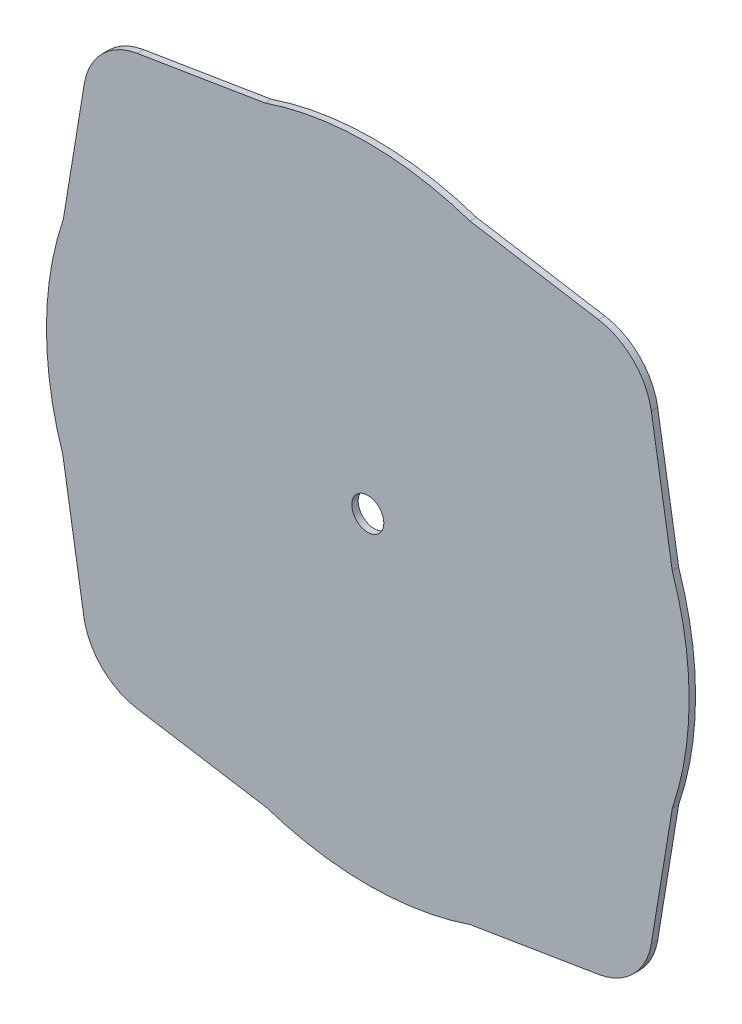
ISO-10303-21;
HEADER;
FILE_DESCRIPTION(('STEP AP214'),'2;1');
FILE_NAME('part.step','',(''),(''),'','','');
FILE_SCHEMA(('AUTOMOTIVE_DESIGN { 1 0 10303 214 1 1 1 1 }'));
ENDSEC;
DATA;
#1=APPLICATION_CONTEXT('core data for automotive mechanical design processes');
#2=APPLICATION_PROTOCOL_DEFINITION('international standard','automotive_design',2000,#1);
#3=PRODUCT_CONTEXT('',#1,'mechanical');
#4=PRODUCT('Part','Part','',(#3));
#5=PRODUCT_RELATED_PRODUCT_CATEGORY('part','',(#4));
#6=PRODUCT_DEFINITION_FORMATION('','',#4);
#7=PRODUCT_DEFINITION_CONTEXT('part definition',#1,'design');
#8=PRODUCT_DEFINITION('design','',#6,#7);
#9=PRODUCT_DEFINITION_SHAPE('','',#8);
#10=(LENGTH_UNIT() NAMED_UNIT(*) SI_UNIT(.MILLI.,.METRE.));
#11=(NAMED_UNIT(*) PLANE_ANGLE_UNIT() SI_UNIT($,.RADIAN.));
#12=(NAMED_UNIT(*) SI_UNIT($,.STERADIAN.) SOLID_ANGLE_UNIT());
#13=UNCERTAINTY_MEASURE_WITH_UNIT(LENGTH_MEASURE(1.E-05),#10,'distance_accuracy_value','');
#14=(GEOMETRIC_REPRESENTATION_CONTEXT(3) GLOBAL_UNCERTAINTY_ASSIGNED_CONTEXT((#13)) GLOBAL_UNIT_ASSIGNED_CONTEXT((#10,
#11,#12)) REPRESENTATION_CONTEXT('',''));
#15=CARTESIAN_POINT('',(0.,0.,0.));
#16=DIRECTION('',(0.,0.,1.));
#17=DIRECTION('',(1.,0.,0.));
#18=AXIS2_PLACEMENT_3D('',#15,#16,#17);
#19=CARTESIAN_POINT('',(-2.15173033894841,-50.4765277075778,3.81));
#20=DIRECTION('',(0.,0.,-1.));
#21=DIRECTION('',(-1.,0.,0.));
#22=AXIS2_PLACEMENT_3D('',#19,#20,#21);
#23=PLANE('',#22);
#24=CARTESIAN_POINT('',(-2.15173033894841,-50.4765277075778,3.81));
#25=DIRECTION('',(0.,0.,1.));
#26=DIRECTION('',(-1.,0.,0.));
#27=AXIS2_PLACEMENT_3D('',#24,#25,#26);
#28=CIRCLE('',#27,25.4);
#29=CARTESIAN_POINT('',(1.96053811004022,-75.5414284295725,3.81));
#30=VERTEX_POINT('',#29);
#31=CARTESIAN_POINT('',(22.9131703830464,-54.5887961565664,3.81));
#32=VERTEX_POINT('',#31);
#33=EDGE_CURVE('E210',#30,#32,#28,.T.);
#34=ORIENTED_EDGE('',*,*,#33,.T.);
#35=DIRECTION('',(0.161900332637346,0.986807115039163,0.));
#36=VECTOR('',#35,1.);
#37=CARTESIAN_POINT('',(22.9131703830464,-54.5887961565664,3.81));
#38=LINE('',#37,#36);
#39=CARTESIAN_POINT('',(31.2401384979266,-3.83466088944323,3.81));
#40=VERTEX_POINT('',#39);
#41=EDGE_CURVE('E118',#32,#40,#38,.T.);
#42=ORIENTED_EDGE('',*,*,#41,.T.);
#43=CARTESIAN_POINT('',(-89.5119708181495,36.8837127716233,3.81));
#44=DIRECTION('',(0.,0.,1.));
#45=DIRECTION('',(1.,0.,0.));
#46=AXIS2_PLACEMENT_3D('',#43,#44,#45);
#47=CIRCLE('',#46,127.432562);
#48=CARTESIAN_POINT('',(31.2401384979268,77.6020864326893,3.81));
#49=VERTEX_POINT('',#48);
#50=EDGE_CURVE('E249',#40,#49,#47,.T.);
#51=ORIENTED_EDGE('',*,*,#50,.T.);
#52=DIRECTION('',(-0.161900332637348,0.986807115039163,0.));
#53=VECTOR('',#52,1.);
#54=CARTESIAN_POINT('',(22.911997890501,128.363368219942,3.81));
#55=LINE('',#54,#53);
#56=CARTESIAN_POINT('',(22.911997890501,128.363368219942,3.81));
#57=VERTEX_POINT('',#56);
#58=EDGE_CURVE('E268',#49,#57,#55,.T.);
#59=ORIENTED_EDGE('',*,*,#58,.T.);
#60=CARTESIAN_POINT('',(-2.15290283149376,124.251099770954,3.81));
#61=DIRECTION('',(0.,0.,1.));
#62=DIRECTION('',(1.,0.,0.));
#63=AXIS2_PLACEMENT_3D('',#60,#61,#62);
#64=CIRCLE('',#63,25.4);
#65=CARTESIAN_POINT('',(1.96879663922517,149.314451371908,3.81));
#66=VERTEX_POINT('',#65);
#67=EDGE_CURVE('E265',#57,#66,#64,.T.);
#68=ORIENTED_EDGE('',*,*,#67,.T.);
#69=DIRECTION('',(-0.986746126021836,0.16227163270547,0.));
#70=VECTOR('',#69,1.);
#71=CARTESIAN_POINT('',(1.96879663922517,149.314451371908,3.81));
#72=LINE('',#71,#70);
#73=CARTESIAN_POINT('',(-48.948025434056,157.68778634847,3.81));
#74=VERTEX_POINT('',#73);
#75=EDGE_CURVE('E267',#66,#74,#72,.T.);
#76=ORIENTED_EDGE('',*,*,#75,.T.);
#77=CARTESIAN_POINT('',(-89.5119708181495,36.8837127716233,3.81));
#78=DIRECTION('',(0.,0.,1.));
#79=DIRECTION('',(1.,0.,0.));
#80=AXIS2_PLACEMENT_3D('',#77,#78,#79);
#81=CIRCLE('',#80,127.432562);
#82=CARTESIAN_POINT('',(-130.390296860395,157.581767096736,3.81));
#83=VERTEX_POINT('',#82);
#84=EDGE_CURVE('E270',#74,#83,#81,.T.);
#85=ORIENTED_EDGE('',*,*,#84,.T.);
#86=DIRECTION('',(-0.986870966676808,-0.161510665686145,0.));
#87=VECTOR('',#86,1.);
#88=CARTESIAN_POINT('',(-180.975812960225,149.302974169153,3.81));
#89=LINE('',#88,#87);
#90=CARTESIAN_POINT('',(-180.975812960225,149.302974169153,3.81));
#91=VERTEX_POINT('',#90);
#92=EDGE_CURVE('E276',#83,#91,#89,.T.);
#93=ORIENTED_EDGE('',*,*,#92,.T.);
#94=CARTESIAN_POINT('',(-176.873442051797,124.236451615562,3.81));
#95=DIRECTION('',(0.,0.,1.));
#96=DIRECTION('',(-1.,0.,0.));
#97=AXIS2_PLACEMENT_3D('',#94,#95,#96);
#98=CIRCLE('',#97,25.4);
#99=CARTESIAN_POINT('',(-201.938342773792,128.34872006455,3.81));
#100=VERTEX_POINT('',#99);
#101=EDGE_CURVE('E278',#91,#100,#98,.T.);
#102=ORIENTED_EDGE('',*,*,#101,.T.);
#103=DIRECTION('',(-0.161900332637347,-0.986807115039163,0.));
#104=VECTOR('',#103,1.);
#105=CARTESIAN_POINT('',(-201.938342773792,128.34872006455,3.81));
#106=LINE('',#105,#104);
#107=CARTESIAN_POINT('',(-210.264080134226,77.6020864326893,3.81));
#108=VERTEX_POINT('',#107);
#109=EDGE_CURVE('E280',#100,#108,#106,.T.);
#110=ORIENTED_EDGE('',*,*,#109,.T.);
#111=CARTESIAN_POINT('',(-89.5119708181495,36.8837127716233,3.81));
#112=DIRECTION('',(0.,0.,1.));
#113=DIRECTION('',(1.,0.,0.));
#114=AXIS2_PLACEMENT_3D('',#111,#112,#113);
#115=CIRCLE('',#114,127.432562);
#116=CARTESIAN_POINT('',(-210.433208356934,-3.32962046466251,3.81));
#117=VERTEX_POINT('',#116);
#118=EDGE_CURVE('E282',#108,#117,#115,.T.);
#119=ORIENTED_EDGE('',*,*,#118,.T.);
#120=DIRECTION('',(0.159837788965892,-0.987143293153783,0.));
#121=VECTOR('',#120,1.);
#122=CARTESIAN_POINT('',(-202.114490475035,-54.7052470788899,3.81));
#123=LINE('',#122,#121);
#124=CARTESIAN_POINT('',(-202.114490475035,-54.7052470788899,3.81));
#125=VERTEX_POINT('',#124);
#126=EDGE_CURVE('E284',#117,#125,#123,.T.);
#127=ORIENTED_EDGE('',*,*,#126,.T.);
#128=CARTESIAN_POINT('',(-177.041050828929,-50.6453672391563,3.81));
#129=DIRECTION('',(0.,0.,1.));
#130=DIRECTION('',(1.,0.,0.));
#131=AXIS2_PLACEMENT_3D('',#128,#129,#130);
#132=CIRCLE('',#131,25.4);
#133=CARTESIAN_POINT('',(-181.100930668663,-75.7188068852624,3.81));
#134=VERTEX_POINT('',#133);
#135=EDGE_CURVE('E161',#125,#134,#132,.T.);
#136=ORIENTED_EDGE('',*,*,#135,.T.);
#137=DIRECTION('',(0.987143293153783,-0.159837788965891,0.));
#138=VECTOR('',#137,1.);
#139=CARTESIAN_POINT('',(-129.725304054436,-84.0375247671616,3.81));
#140=LINE('',#139,#138);
#141=CARTESIAN_POINT('',(-129.725304054436,-84.0375247671616,3.81));
#142=VERTEX_POINT('',#141);
#143=EDGE_CURVE('E155',#134,#142,#140,.T.);
#144=ORIENTED_EDGE('',*,*,#143,.T.);
#145=CARTESIAN_POINT('',(-89.5119708181495,36.8837127716233,3.81));
#146=DIRECTION('',(0.,0.,1.));
#147=DIRECTION('',(1.,0.,0.));
#148=AXIS2_PLACEMENT_3D('',#145,#146,#147);
#149=CIRCLE('',#148,127.432562);
#150=CARTESIAN_POINT('',(-48.7935971570835,-83.868396544453,3.81));
#151=VERTEX_POINT('',#150);
#152=EDGE_CURVE('E159',#142,#151,#149,.T.);
#153=ORIENTED_EDGE('',*,*,#152,.T.);
#154=DIRECTION('',(0.986807115039163,0.161900332637348,0.));
#155=VECTOR('',#154,1.);
#156=CARTESIAN_POINT('',(1.96053811004022,-75.5414284295725,3.81));
#157=LINE('',#156,#155);
#158=EDGE_CURVE('E51',#151,#30,#157,.T.);
#159=ORIENTED_EDGE('',*,*,#158,.T.);
#160=EDGE_LOOP('',(#34,#42,#51,#59,#68,#76,#85,#93,#102,#110,#119,#127,#136,#144,#153,#159));
#161=FACE_BOUND('',#160,.T.);
#162=CARTESIAN_POINT('',(-89.5119708181495,36.8837127716233,3.81));
#163=DIRECTION('',(0.,0.,1.));
#164=DIRECTION('',(1.,0.,0.));
#165=AXIS2_PLACEMENT_3D('',#162,#163,#164);
#166=CIRCLE('',#165,6.34999999993624);
#167=CARTESIAN_POINT('',(-83.1619708182132,36.8837127716233,3.81));
#168=VERTEX_POINT('',#167);
#169=EDGE_CURVE('E183',#168,#168,#166,.T.);
#170=ORIENTED_EDGE('',*,*,#169,.F.);
#171=EDGE_LOOP('',(#170));
#172=FACE_BOUND('',#171,.T.);
#173=ADVANCED_FACE('F34',(#161,#172),#23,.F.);
#174=CARTESIAN_POINT('',(-2.15173033894841,-50.4765277075778,1.27));
#175=DIRECTION('',(0.,0.,-1.));
#176=DIRECTION('',(-1.,0.,0.));
#177=AXIS2_PLACEMENT_3D('',#174,#175,#176);
#178=PLANE('',#177);
#179=CARTESIAN_POINT('',(-2.15173033894841,-50.4765277075778,1.27));
#180=DIRECTION('',(0.,0.,1.));
#181=DIRECTION('',(-1.,0.,0.));
#182=AXIS2_PLACEMENT_3D('',#179,#180,#181);
#183=CIRCLE('',#182,25.4);
#184=CARTESIAN_POINT('',(1.96053811004022,-75.5414284295725,1.27));
#185=VERTEX_POINT('',#184);
#186=CARTESIAN_POINT('',(22.9131703830464,-54.5887961565664,1.27));
#187=VERTEX_POINT('',#186);
#188=EDGE_CURVE('E179',#185,#187,#183,.T.);
#189=ORIENTED_EDGE('',*,*,#188,.F.);
#190=DIRECTION('',(0.986807115039163,0.161900332637348,0.));
#191=VECTOR('',#190,1.);
#192=CARTESIAN_POINT('',(1.96053811004022,-75.5414284295725,1.27));
#193=LINE('',#192,#191);
#194=CARTESIAN_POINT('',(-48.7935971570835,-83.868396544453,1.27));
#195=VERTEX_POINT('',#194);
#196=EDGE_CURVE('E110',#195,#185,#193,.T.);
#197=ORIENTED_EDGE('',*,*,#196,.F.);
#198=CARTESIAN_POINT('',(-89.5119708181495,36.8837127716233,1.27));
#199=DIRECTION('',(0.,0.,1.));
#200=DIRECTION('',(1.,0.,0.));
#201=AXIS2_PLACEMENT_3D('',#198,#199,#200);
#202=CIRCLE('',#201,127.432562);
#203=CARTESIAN_POINT('',(-129.725304054436,-84.0375247671616,1.27));
#204=VERTEX_POINT('',#203);
#205=EDGE_CURVE('E104',#204,#195,#202,.T.);
#206=ORIENTED_EDGE('',*,*,#205,.F.);
#207=DIRECTION('',(0.987143293153783,-0.159837788965891,0.));
#208=VECTOR('',#207,1.);
#209=CARTESIAN_POINT('',(-129.725304054436,-84.0375247671616,1.27));
#210=LINE('',#209,#208);
#211=CARTESIAN_POINT('',(-181.100930668663,-75.7188068852624,1.27));
#212=VERTEX_POINT('',#211);
#213=EDGE_CURVE('E169',#212,#204,#210,.T.);
#214=ORIENTED_EDGE('',*,*,#213,.F.);
#215=CARTESIAN_POINT('',(-177.041050828929,-50.6453672391563,1.27));
#216=DIRECTION('',(0.,0.,1.));
#217=DIRECTION('',(1.,0.,0.));
#218=AXIS2_PLACEMENT_3D('',#215,#216,#217);
#219=CIRCLE('',#218,25.4);
#220=CARTESIAN_POINT('',(-202.114490475035,-54.7052470788899,1.27));
#221=VERTEX_POINT('',#220);
#222=EDGE_CURVE('E205',#221,#212,#219,.T.);
#223=ORIENTED_EDGE('',*,*,#222,.F.);
#224=DIRECTION('',(0.159837788965892,-0.987143293153783,0.));
#225=VECTOR('',#224,1.);
#226=CARTESIAN_POINT('',(-202.114490475035,-54.7052470788899,1.27));
#227=LINE('',#226,#225);
#228=CARTESIAN_POINT('',(-210.433208356934,-3.32962046466251,1.27));
#229=VERTEX_POINT('',#228);
#230=EDGE_CURVE('E203',#229,#221,#227,.T.);
#231=ORIENTED_EDGE('',*,*,#230,.F.);
#232=CARTESIAN_POINT('',(-89.5119708181495,36.8837127716233,1.27));
#233=DIRECTION('',(0.,0.,1.));
#234=DIRECTION('',(1.,0.,0.));
#235=AXIS2_PLACEMENT_3D('',#232,#233,#234);
#236=CIRCLE('',#235,127.432562);
#237=CARTESIAN_POINT('',(-210.264080134226,77.6020864326893,1.27));
#238=VERTEX_POINT('',#237);
#239=EDGE_CURVE('E201',#238,#229,#236,.T.);
#240=ORIENTED_EDGE('',*,*,#239,.F.);
#241=DIRECTION('',(-0.161900332637347,-0.986807115039163,0.));
#242=VECTOR('',#241,1.);
#243=CARTESIAN_POINT('',(-201.938342773792,128.34872006455,1.27));
#244=LINE('',#243,#242);
#245=CARTESIAN_POINT('',(-201.938342773792,128.34872006455,1.27));
#246=VERTEX_POINT('',#245);
#247=EDGE_CURVE('E199',#246,#238,#244,.T.);
#248=ORIENTED_EDGE('',*,*,#247,.F.);
#249=CARTESIAN_POINT('',(-176.873442051797,124.236451615562,1.27));
#250=DIRECTION('',(0.,0.,1.));
#251=DIRECTION('',(-1.,0.,0.));
#252=AXIS2_PLACEMENT_3D('',#249,#250,#251);
#253=CIRCLE('',#252,25.4);
#254=CARTESIAN_POINT('',(-180.975812960225,149.302974169153,1.27));
#255=VERTEX_POINT('',#254);
#256=EDGE_CURVE('E197',#255,#246,#253,.T.);
#257=ORIENTED_EDGE('',*,*,#256,.F.);
#258=DIRECTION('',(-0.986870966676808,-0.161510665686145,0.));
#259=VECTOR('',#258,1.);
#260=CARTESIAN_POINT('',(-180.975812960225,149.302974169153,1.27));
#261=LINE('',#260,#259);
#262=CARTESIAN_POINT('',(-130.390296860395,157.581767096736,1.27));
#263=VERTEX_POINT('',#262);
#264=EDGE_CURVE('E195',#263,#255,#261,.T.);
#265=ORIENTED_EDGE('',*,*,#264,.F.);
#266=CARTESIAN_POINT('',(-89.5119708181495,36.8837127716233,1.27));
#267=DIRECTION('',(0.,0.,1.));
#268=DIRECTION('',(1.,0.,0.));
#269=AXIS2_PLACEMENT_3D('',#266,#267,#268);
#270=CIRCLE('',#269,127.432562);
#271=CARTESIAN_POINT('',(-48.948025434056,157.68778634847,1.27));
#272=VERTEX_POINT('',#271);
#273=EDGE_CURVE('E193',#272,#263,#270,.T.);
#274=ORIENTED_EDGE('',*,*,#273,.F.);
#275=DIRECTION('',(-0.986746126021836,0.16227163270547,0.));
#276=VECTOR('',#275,1.);
#277=CARTESIAN_POINT('',(1.96879663922517,149.314451371908,1.27));
#278=LINE('',#277,#276);
#279=CARTESIAN_POINT('',(1.96879663922517,149.314451371908,1.27));
#280=VERTEX_POINT('',#279);
#281=EDGE_CURVE('E191',#280,#272,#278,.T.);
#282=ORIENTED_EDGE('',*,*,#281,.F.);
#283=CARTESIAN_POINT('',(-2.15290283149376,124.251099770954,1.27));
#284=DIRECTION('',(0.,0.,1.));
#285=DIRECTION('',(1.,0.,0.));
#286=AXIS2_PLACEMENT_3D('',#283,#284,#285);
#287=CIRCLE('',#286,25.4);
#288=CARTESIAN_POINT('',(22.911997890501,128.363368219942,1.27));
#289=VERTEX_POINT('',#288);
#290=EDGE_CURVE('E189',#289,#280,#287,.T.);
#291=ORIENTED_EDGE('',*,*,#290,.F.);
#292=DIRECTION('',(-0.161900332637348,0.986807115039163,0.));
#293=VECTOR('',#292,1.);
#294=CARTESIAN_POINT('',(22.911997890501,128.363368219942,1.27));
#295=LINE('',#294,#293);
#296=CARTESIAN_POINT('',(31.2401384979268,77.6020864326893,1.27));
#297=VERTEX_POINT('',#296);
#298=EDGE_CURVE('E187',#297,#289,#295,.T.);
#299=ORIENTED_EDGE('',*,*,#298,.F.);
#300=CARTESIAN_POINT('',(-89.5119708181495,36.8837127716233,1.27));
#301=DIRECTION('',(0.,0.,1.));
#302=DIRECTION('',(1.,0.,0.));
#303=AXIS2_PLACEMENT_3D('',#300,#301,#302);
#304=CIRCLE('',#303,127.432562);
#305=CARTESIAN_POINT('',(31.2401384979266,-3.83466088944323,1.27));
#306=VERTEX_POINT('',#305);
#307=EDGE_CURVE('E185',#306,#297,#304,.T.);
#308=ORIENTED_EDGE('',*,*,#307,.F.);
#309=DIRECTION('',(0.161900332637346,0.986807115039163,0.));
#310=VECTOR('',#309,1.);
#311=CARTESIAN_POINT('',(22.9131703830464,-54.5887961565664,1.27));
#312=LINE('',#311,#310);
#313=EDGE_CURVE('E182',#187,#306,#312,.T.);
#314=ORIENTED_EDGE('',*,*,#313,.F.);
#315=EDGE_LOOP('',(#189,#197,#206,#214,#223,#231,#240,#248,#257,#265,#274,#282,#291,#299,#308,#314));
#316=FACE_BOUND('',#315,.T.);
#317=CARTESIAN_POINT('',(-89.5119708181495,36.8837127716233,1.27));
#318=DIRECTION('',(0.,0.,1.));
#319=DIRECTION('',(1.,0.,0.));
#320=AXIS2_PLACEMENT_3D('',#317,#318,#319);
#321=CIRCLE('',#320,6.34999999993624);
#322=CARTESIAN_POINT('',(-83.1619708182132,36.8837127716233,1.27));
#323=VERTEX_POINT('',#322);
#324=EDGE_CURVE('E483',#323,#323,#321,.T.);
#325=ORIENTED_EDGE('',*,*,#324,.T.);
#326=EDGE_LOOP('',(#325));
#327=FACE_BOUND('',#326,.T.);
#328=ADVANCED_FACE('F253',(#316,#327),#178,.T.);
#329=CARTESIAN_POINT('',(-2.15173033894841,-50.4765277075778,3.81));
#330=DIRECTION('',(0.,0.,-1.));
#331=DIRECTION('',(-1.,0.,0.));
#332=AXIS2_PLACEMENT_3D('',#329,#330,#331);
#333=CYLINDRICAL_SURFACE('',#332,25.4);
#334=ORIENTED_EDGE('',*,*,#188,.T.);
#335=DIRECTION('',(0.,0.,-1.));
#336=VECTOR('',#335,1.);
#337=CARTESIAN_POINT('',(22.9131703830464,-54.5887961565664,3.81));
#338=LINE('',#337,#336);
#339=EDGE_CURVE('E11',#32,#187,#338,.T.);
#340=ORIENTED_EDGE('',*,*,#339,.F.);
#341=ORIENTED_EDGE('',*,*,#33,.F.);
#342=DIRECTION('',(0.,0.,-1.));
#343=VECTOR('',#342,1.);
#344=CARTESIAN_POINT('',(1.96053811004022,-75.5414284295725,3.81));
#345=LINE('',#344,#343);
#346=EDGE_CURVE('E175',#30,#185,#345,.T.);
#347=ORIENTED_EDGE('',*,*,#346,.T.);
#348=EDGE_LOOP('',(#334,#340,#341,#347));
#349=FACE_BOUND('',#348,.T.);
#350=ADVANCED_FACE('F36',(#349),#333,.T.);
#351=CARTESIAN_POINT('',(22.9131703830464,-54.5887961565664,3.81));
#352=DIRECTION('',(-0.986807115039164,0.161900332637346,0.));
#353=DIRECTION('',(-0.161900332637346,-0.986807115039164,0.));
#354=AXIS2_PLACEMENT_3D('',#351,#352,#353);
#355=PLANE('',#354);
#356=ORIENTED_EDGE('',*,*,#313,.T.);
#357=DIRECTION('',(0.,0.,-1.));
#358=VECTOR('',#357,1.);
#359=CARTESIAN_POINT('',(31.2401384979266,-3.83466088944323,3.81));
#360=LINE('',#359,#358);
#361=EDGE_CURVE('E43',#40,#306,#360,.T.);
#362=ORIENTED_EDGE('',*,*,#361,.F.);
#363=ORIENTED_EDGE('',*,*,#41,.F.);
#364=ORIENTED_EDGE('',*,*,#339,.T.);
#365=EDGE_LOOP('',(#356,#362,#363,#364));
#366=FACE_BOUND('',#365,.T.);
#367=ADVANCED_FACE('F318',(#366),#355,.F.);
#368=CARTESIAN_POINT('',(-89.5119708181495,36.8837127716233,3.81));
#369=DIRECTION('',(0.,0.,-1.));
#370=DIRECTION('',(-1.,0.,0.));
#371=AXIS2_PLACEMENT_3D('',#368,#369,#370);
#372=CYLINDRICAL_SURFACE('',#371,127.432562);
#373=ORIENTED_EDGE('',*,*,#307,.T.);
#374=DIRECTION('',(0.,0.,-1.));
#375=VECTOR('',#374,1.);
#376=CARTESIAN_POINT('',(31.2401384979268,77.6020864326893,3.81));
#377=LINE('',#376,#375);
#378=EDGE_CURVE('E241',#49,#297,#377,.T.);
#379=ORIENTED_EDGE('',*,*,#378,.F.);
#380=ORIENTED_EDGE('',*,*,#50,.F.);
#381=ORIENTED_EDGE('',*,*,#361,.T.);
#382=EDGE_LOOP('',(#373,#379,#380,#381));
#383=FACE_BOUND('',#382,.T.);
#384=ADVANCED_FACE('F247',(#383),#372,.T.);
#385=CARTESIAN_POINT('',(22.911997890501,128.363368219942,3.81));
#386=DIRECTION('',(-0.986807115039163,-0.161900332637348,0.));
#387=DIRECTION('',(0.161900332637348,-0.986807115039163,0.));
#388=AXIS2_PLACEMENT_3D('',#385,#386,#387);
#389=PLANE('',#388);
#390=ORIENTED_EDGE('',*,*,#298,.T.);
#391=DIRECTION('',(0.,0.,-1.));
#392=VECTOR('',#391,1.);
#393=CARTESIAN_POINT('',(22.911997890501,128.363368219942,3.81));
#394=LINE('',#393,#392);
#395=EDGE_CURVE('E238',#57,#289,#394,.T.);
#396=ORIENTED_EDGE('',*,*,#395,.F.);
#397=ORIENTED_EDGE('',*,*,#58,.F.);
#398=ORIENTED_EDGE('',*,*,#378,.T.);
#399=EDGE_LOOP('',(#390,#396,#397,#398));
#400=FACE_BOUND('',#399,.T.);
#401=ADVANCED_FACE('F259',(#400),#389,.F.);
#402=CARTESIAN_POINT('',(-2.15290283149376,124.251099770954,3.81));
#403=DIRECTION('',(0.,0.,-1.));
#404=DIRECTION('',(-1.,0.,0.));
#405=AXIS2_PLACEMENT_3D('',#402,#403,#404);
#406=CYLINDRICAL_SURFACE('',#405,25.4);
#407=ORIENTED_EDGE('',*,*,#290,.T.);
#408=DIRECTION('',(0.,0.,-1.));
#409=VECTOR('',#408,1.);
#410=CARTESIAN_POINT('',(1.96879663922517,149.314451371908,3.81));
#411=LINE('',#410,#409);
#412=EDGE_CURVE('E235',#66,#280,#411,.T.);
#413=ORIENTED_EDGE('',*,*,#412,.F.);
#414=ORIENTED_EDGE('',*,*,#67,.F.);
#415=ORIENTED_EDGE('',*,*,#395,.T.);
#416=EDGE_LOOP('',(#407,#413,#414,#415));
#417=FACE_BOUND('',#416,.T.);
#418=ADVANCED_FACE('F263',(#417),#406,.T.);
#419=CARTESIAN_POINT('',(1.96879663922517,149.314451371908,3.81));
#420=DIRECTION('',(-0.16227163270547,-0.986746126021836,0.));
#421=DIRECTION('',(0.986746126021836,-0.16227163270547,0.));
#422=AXIS2_PLACEMENT_3D('',#419,#420,#421);
#423=PLANE('',#422);
#424=ORIENTED_EDGE('',*,*,#281,.T.);
#425=DIRECTION('',(0.,0.,-1.));
#426=VECTOR('',#425,1.);
#427=CARTESIAN_POINT('',(-48.948025434056,157.68778634847,3.81));
#428=LINE('',#427,#426);
#429=EDGE_CURVE('E232',#74,#272,#428,.T.);
#430=ORIENTED_EDGE('',*,*,#429,.F.);
#431=ORIENTED_EDGE('',*,*,#75,.F.);
#432=ORIENTED_EDGE('',*,*,#412,.T.);
#433=EDGE_LOOP('',(#424,#430,#431,#432));
#434=FACE_BOUND('',#433,.T.);
#435=ADVANCED_FACE('F331',(#434),#423,.F.);
#436=CARTESIAN_POINT('',(-89.5119708181495,36.8837127716233,3.81));
#437=DIRECTION('',(0.,0.,-1.));
#438=DIRECTION('',(-1.,0.,0.));
#439=AXIS2_PLACEMENT_3D('',#436,#437,#438);
#440=CYLINDRICAL_SURFACE('',#439,127.432562);
#441=ORIENTED_EDGE('',*,*,#273,.T.);
#442=DIRECTION('',(0.,0.,-1.));
#443=VECTOR('',#442,1.);
#444=CARTESIAN_POINT('',(-130.390296860395,157.581767096736,3.81));
#445=LINE('',#444,#443);
#446=EDGE_CURVE('E229',#83,#263,#445,.T.);
#447=ORIENTED_EDGE('',*,*,#446,.F.);
#448=ORIENTED_EDGE('',*,*,#84,.F.);
#449=ORIENTED_EDGE('',*,*,#429,.T.);
#450=EDGE_LOOP('',(#441,#447,#448,#449));
#451=FACE_BOUND('',#450,.T.);
#452=ADVANCED_FACE('F334',(#451),#440,.T.);
#453=CARTESIAN_POINT('',(-180.975812960225,149.302974169153,3.81));
#454=DIRECTION('',(0.161510665686145,-0.986870966676808,0.));
#455=DIRECTION('',(0.986870966676808,0.161510665686145,0.));
#456=AXIS2_PLACEMENT_3D('',#453,#454,#455);
#457=PLANE('',#456);
#458=ORIENTED_EDGE('',*,*,#264,.T.);
#459=DIRECTION('',(0.,0.,-1.));
#460=VECTOR('',#459,1.);
#461=CARTESIAN_POINT('',(-180.975812960225,149.302974169153,3.81));
#462=LINE('',#461,#460);
#463=EDGE_CURVE('E226',#91,#255,#462,.T.);
#464=ORIENTED_EDGE('',*,*,#463,.F.);
#465=ORIENTED_EDGE('',*,*,#92,.F.);
#466=ORIENTED_EDGE('',*,*,#446,.T.);
#467=EDGE_LOOP('',(#458,#464,#465,#466));
#468=FACE_BOUND('',#467,.T.);
#469=ADVANCED_FACE('F338',(#468),#457,.F.);
#470=CARTESIAN_POINT('',(-176.873442051797,124.236451615562,3.81));
#471=DIRECTION('',(0.,0.,-1.));
#472=DIRECTION('',(-1.,0.,0.));
#473=AXIS2_PLACEMENT_3D('',#470,#471,#472);
#474=CYLINDRICAL_SURFACE('',#473,25.4);
#475=ORIENTED_EDGE('',*,*,#256,.T.);
#476=DIRECTION('',(0.,0.,-1.));
#477=VECTOR('',#476,1.);
#478=CARTESIAN_POINT('',(-201.938342773792,128.34872006455,3.81));
#479=LINE('',#478,#477);
#480=EDGE_CURVE('E223',#100,#246,#479,.T.);
#481=ORIENTED_EDGE('',*,*,#480,.F.);
#482=ORIENTED_EDGE('',*,*,#101,.F.);
#483=ORIENTED_EDGE('',*,*,#463,.T.);
#484=EDGE_LOOP('',(#475,#481,#482,#483));
#485=FACE_BOUND('',#484,.T.);
#486=ADVANCED_FACE('F342',(#485),#474,.T.);
#487=CARTESIAN_POINT('',(-201.938342773792,128.34872006455,3.81));
#488=DIRECTION('',(0.986807115039163,-0.161900332637347,0.));
#489=DIRECTION('',(0.161900332637347,0.986807115039163,0.));
#490=AXIS2_PLACEMENT_3D('',#487,#488,#489);
#491=PLANE('',#490);
#492=ORIENTED_EDGE('',*,*,#247,.T.);
#493=DIRECTION('',(0.,0.,-1.));
#494=VECTOR('',#493,1.);
#495=CARTESIAN_POINT('',(-210.264080134226,77.6020864326893,3.81));
#496=LINE('',#495,#494);
#497=EDGE_CURVE('E220',#108,#238,#496,.T.);
#498=ORIENTED_EDGE('',*,*,#497,.F.);
#499=ORIENTED_EDGE('',*,*,#109,.F.);
#500=ORIENTED_EDGE('',*,*,#480,.T.);
#501=EDGE_LOOP('',(#492,#498,#499,#500));
#502=FACE_BOUND('',#501,.T.);
#503=ADVANCED_FACE('F346',(#502),#491,.F.);
#504=CARTESIAN_POINT('',(-89.5119708181495,36.8837127716233,3.81));
#505=DIRECTION('',(0.,0.,-1.));
#506=DIRECTION('',(-1.,0.,0.));
#507=AXIS2_PLACEMENT_3D('',#504,#505,#506);
#508=CYLINDRICAL_SURFACE('',#507,127.432562);
#509=ORIENTED_EDGE('',*,*,#239,.T.);
#510=DIRECTION('',(0.,0.,-1.));
#511=VECTOR('',#510,1.);
#512=CARTESIAN_POINT('',(-210.433208356934,-3.32962046466251,3.81));
#513=LINE('',#512,#511);
#514=EDGE_CURVE('E217',#117,#229,#513,.T.);
#515=ORIENTED_EDGE('',*,*,#514,.F.);
#516=ORIENTED_EDGE('',*,*,#118,.F.);
#517=ORIENTED_EDGE('',*,*,#497,.T.);
#518=EDGE_LOOP('',(#509,#515,#516,#517));
#519=FACE_BOUND('',#518,.T.);
#520=ADVANCED_FACE('F350',(#519),#508,.T.);
#521=CARTESIAN_POINT('',(-202.114490475035,-54.7052470788899,3.81));
#522=DIRECTION('',(0.987143293153783,0.159837788965892,0.));
#523=DIRECTION('',(-0.159837788965892,0.987143293153783,0.));
#524=AXIS2_PLACEMENT_3D('',#521,#522,#523);
#525=PLANE('',#524);
#526=ORIENTED_EDGE('',*,*,#230,.T.);
#527=DIRECTION('',(0.,0.,-1.));
#528=VECTOR('',#527,1.);
#529=CARTESIAN_POINT('',(-202.114490475035,-54.7052470788899,3.81));
#530=LINE('',#529,#528);
#531=EDGE_CURVE('E214',#125,#221,#530,.T.);
#532=ORIENTED_EDGE('',*,*,#531,.F.);
#533=ORIENTED_EDGE('',*,*,#126,.F.);
#534=ORIENTED_EDGE('',*,*,#514,.T.);
#535=EDGE_LOOP('',(#526,#532,#533,#534));
#536=FACE_BOUND('',#535,.T.);
#537=ADVANCED_FACE('F290',(#536),#525,.F.);
#538=CARTESIAN_POINT('',(-177.041050828929,-50.6453672391563,3.81));
#539=DIRECTION('',(0.,0.,-1.));
#540=DIRECTION('',(-1.,0.,0.));
#541=AXIS2_PLACEMENT_3D('',#538,#539,#540);
#542=CYLINDRICAL_SURFACE('',#541,25.4);
#543=ORIENTED_EDGE('',*,*,#222,.T.);
#544=DIRECTION('',(0.,0.,-1.));
#545=VECTOR('',#544,1.);
#546=CARTESIAN_POINT('',(-181.100930668663,-75.7188068852624,3.81));
#547=LINE('',#546,#545);
#548=EDGE_CURVE('E170',#134,#212,#547,.T.);
#549=ORIENTED_EDGE('',*,*,#548,.F.);
#550=ORIENTED_EDGE('',*,*,#135,.F.);
#551=ORIENTED_EDGE('',*,*,#531,.T.);
#552=EDGE_LOOP('',(#543,#549,#550,#551));
#553=FACE_BOUND('',#552,.T.);
#554=ADVANCED_FACE('F294',(#553),#542,.T.);
#555=CARTESIAN_POINT('',(-129.725304054436,-84.0375247671616,3.81));
#556=DIRECTION('',(0.159837788965891,0.987143293153783,0.));
#557=DIRECTION('',(-0.987143293153783,0.159837788965891,0.));
#558=AXIS2_PLACEMENT_3D('',#555,#556,#557);
#559=PLANE('',#558);
#560=ORIENTED_EDGE('',*,*,#213,.T.);
#561=DIRECTION('',(0.,0.,-1.));
#562=VECTOR('',#561,1.);
#563=CARTESIAN_POINT('',(-129.725304054436,-84.0375247671616,3.81));
#564=LINE('',#563,#562);
#565=EDGE_CURVE('E166',#142,#204,#564,.T.);
#566=ORIENTED_EDGE('',*,*,#565,.F.);
#567=ORIENTED_EDGE('',*,*,#143,.F.);
#568=ORIENTED_EDGE('',*,*,#548,.T.);
#569=EDGE_LOOP('',(#560,#566,#567,#568));
#570=FACE_BOUND('',#569,.T.);
#571=ADVANCED_FACE('F167',(#570),#559,.F.);
#572=CARTESIAN_POINT('',(-89.5119708181495,36.8837127716233,3.81));
#573=DIRECTION('',(0.,0.,-1.));
#574=DIRECTION('',(-1.,0.,0.));
#575=AXIS2_PLACEMENT_3D('',#572,#573,#574);
#576=CYLINDRICAL_SURFACE('',#575,127.432562);
#577=ORIENTED_EDGE('',*,*,#205,.T.);
#578=DIRECTION('',(0.,0.,-1.));
#579=VECTOR('',#578,1.);
#580=CARTESIAN_POINT('',(-48.7935971570835,-83.868396544453,3.81));
#581=LINE('',#580,#579);
#582=EDGE_CURVE('E171',#151,#195,#581,.T.);
#583=ORIENTED_EDGE('',*,*,#582,.F.);
#584=ORIENTED_EDGE('',*,*,#152,.F.);
#585=ORIENTED_EDGE('',*,*,#565,.T.);
#586=EDGE_LOOP('',(#577,#583,#584,#585));
#587=FACE_BOUND('',#586,.T.);
#588=ADVANCED_FACE('F173',(#587),#576,.T.);
#589=CARTESIAN_POINT('',(1.96053811004022,-75.5414284295725,3.81));
#590=DIRECTION('',(-0.161900332637348,0.986807115039163,0.));
#591=DIRECTION('',(-0.986807115039163,-0.161900332637348,0.));
#592=AXIS2_PLACEMENT_3D('',#589,#590,#591);
#593=PLANE('',#592);
#594=ORIENTED_EDGE('',*,*,#196,.T.);
#595=ORIENTED_EDGE('',*,*,#346,.F.);
#596=ORIENTED_EDGE('',*,*,#158,.F.);
#597=ORIENTED_EDGE('',*,*,#582,.T.);
#598=EDGE_LOOP('',(#594,#595,#596,#597));
#599=FACE_BOUND('',#598,.T.);
#600=ADVANCED_FACE('F298',(#599),#593,.F.);
#601=CARTESIAN_POINT('',(-89.5119708181495,36.8837127716233,3.81));
#602=DIRECTION('',(0.,0.,-1.));
#603=DIRECTION('',(-1.,0.,0.));
#604=AXIS2_PLACEMENT_3D('',#601,#602,#603);
#605=CYLINDRICAL_SURFACE('',#604,6.34999999993624);
#606=ORIENTED_EDGE('',*,*,#169,.T.);
#607=EDGE_LOOP('',(#606));
#608=FACE_BOUND('',#607,.T.);
#609=ORIENTED_EDGE('',*,*,#324,.F.);
#610=EDGE_LOOP('',(#609));
#611=FACE_BOUND('',#610,.T.);
#612=ADVANCED_FACE('F300',(#608,#611),#605,.F.);
#613=CLOSED_SHELL('',(#173,#328,#350,#367,#384,#401,#418,#435,#452,#469,#486,#503,#520,#537,
#554,#571,#588,#600,#612));
#614=MANIFOLD_SOLID_BREP('B2',#613);
#615=ADVANCED_BREP_SHAPE_REPRESENTATION('',(#18,#614),#14);
#616=SHAPE_DEFINITION_REPRESENTATION(#9,#615);
ENDSEC;
END-ISO-10303-21;
